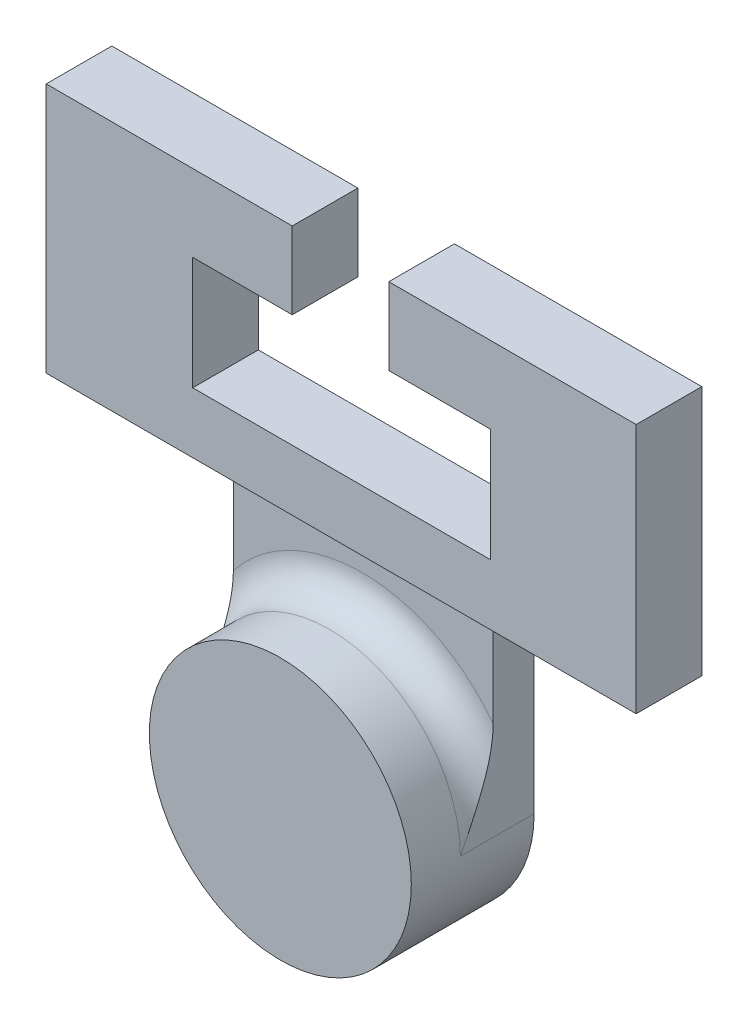
ISO-10303-21;
HEADER;
FILE_DESCRIPTION(('STEP AP214'),'2;1');
FILE_NAME('part.step','',(''),(''),'','','');
FILE_SCHEMA(('AUTOMOTIVE_DESIGN { 1 0 10303 214 1 1 1 1 }'));
ENDSEC;
DATA;
#1=APPLICATION_CONTEXT('core data for automotive mechanical design processes');
#2=APPLICATION_PROTOCOL_DEFINITION('international standard','automotive_design',2000,#1);
#3=PRODUCT_CONTEXT('',#1,'mechanical');
#4=PRODUCT('Part','Part','',(#3));
#5=PRODUCT_RELATED_PRODUCT_CATEGORY('part','',(#4));
#6=PRODUCT_DEFINITION_FORMATION('','',#4);
#7=PRODUCT_DEFINITION_CONTEXT('part definition',#1,'design');
#8=PRODUCT_DEFINITION('design','',#6,#7);
#9=PRODUCT_DEFINITION_SHAPE('','',#8);
#10=(LENGTH_UNIT() NAMED_UNIT(*) SI_UNIT(.MILLI.,.METRE.));
#11=(NAMED_UNIT(*) PLANE_ANGLE_UNIT() SI_UNIT($,.RADIAN.));
#12=(NAMED_UNIT(*) SI_UNIT($,.STERADIAN.) SOLID_ANGLE_UNIT());
#13=UNCERTAINTY_MEASURE_WITH_UNIT(LENGTH_MEASURE(1.E-05),#10,'distance_accuracy_value','');
#14=(GEOMETRIC_REPRESENTATION_CONTEXT(3) GLOBAL_UNCERTAINTY_ASSIGNED_CONTEXT((#13)) GLOBAL_UNIT_ASSIGNED_CONTEXT((#10,
#11,#12)) REPRESENTATION_CONTEXT('',''));
#15=CARTESIAN_POINT('',(0.,0.,0.));
#16=DIRECTION('',(0.,0.,1.));
#17=DIRECTION('',(1.,0.,0.));
#18=AXIS2_PLACEMENT_3D('',#15,#16,#17);
#19=CARTESIAN_POINT('',(0.,0.,-9.525));
#20=DIRECTION('',(0.,0.,1.));
#21=DIRECTION('',(1.,0.,0.));
#22=AXIS2_PLACEMENT_3D('',#19,#20,#21);
#23=CYLINDRICAL_SURFACE('',#22,10.16);
#24=DIRECTION('',(0.,0.,-1.));
#25=VECTOR('',#24,1.);
#26=CARTESIAN_POINT('',(10.16,0.,-6.35));
#27=LINE('',#26,#25);
#28=CARTESIAN_POINT('',(10.16,0.,-3.81));
#29=VERTEX_POINT('',#28);
#30=CARTESIAN_POINT('',(10.16,0.,-9.525));
#31=VERTEX_POINT('',#30);
#32=EDGE_CURVE('E75',#29,#31,#27,.T.);
#33=ORIENTED_EDGE('',*,*,#32,.F.);
#34=CARTESIAN_POINT('',(0.,0.,-3.81));
#35=DIRECTION('',(0.,0.,1.));
#36=DIRECTION('',(1.,0.,0.));
#37=AXIS2_PLACEMENT_3D('',#34,#35,#36);
#38=CIRCLE('',#37,10.16);
#39=CARTESIAN_POINT('',(-9.99152441464391,1.84256339689434,-3.81));
#40=VERTEX_POINT('',#39);
#41=EDGE_CURVE('E402',#29,#40,#38,.T.);
#42=ORIENTED_EDGE('',*,*,#41,.T.);
#43=DIRECTION('',(0.,0.,1.));
#44=VECTOR('',#43,1.);
#45=CARTESIAN_POINT('',(-9.99152441464391,1.84256339689434,-9.525));
#46=LINE('',#45,#44);
#47=CARTESIAN_POINT('',(-9.99152441464391,1.84256339689432,-9.525));
#48=VERTEX_POINT('',#47);
#49=EDGE_CURVE('E78',#48,#40,#46,.T.);
#50=ORIENTED_EDGE('',*,*,#49,.F.);
#51=CARTESIAN_POINT('',(0.,0.,-9.525));
#52=DIRECTION('',(0.,0.,1.));
#53=DIRECTION('',(1.,0.,0.));
#54=AXIS2_PLACEMENT_3D('',#51,#52,#53);
#55=CIRCLE('',#54,10.16);
#56=EDGE_CURVE('E292',#48,#31,#55,.T.);
#57=ORIENTED_EDGE('',*,*,#56,.T.);
#58=EDGE_LOOP('',(#33,#42,#50,#57));
#59=FACE_BOUND('',#58,.T.);
#60=CARTESIAN_POINT('',(0.,0.,0.));
#61=DIRECTION('',(0.,0.,1.));
#62=DIRECTION('',(1.,0.,0.));
#63=AXIS2_PLACEMENT_3D('',#60,#61,#62);
#64=CIRCLE('',#63,10.16);
#65=CARTESIAN_POINT('',(10.16,0.,0.));
#66=VERTEX_POINT('',#65);
#67=EDGE_CURVE('E288',#66,#66,#64,.T.);
#68=ORIENTED_EDGE('',*,*,#67,.F.);
#69=EDGE_LOOP('',(#68));
#70=FACE_BOUND('',#69,.T.);
#71=ADVANCED_FACE('F49',(#59,#70),#23,.T.);
#72=CARTESIAN_POINT('',(0.,0.,-9.525));
#73=DIRECTION('',(0.,0.,1.));
#74=DIRECTION('',(1.,0.,0.));
#75=AXIS2_PLACEMENT_3D('',#72,#73,#74);
#76=PLANE('',#75);
#77=ORIENTED_EDGE('',*,*,#56,.F.);
#78=DIRECTION('',(0.,1.,0.));
#79=VECTOR('',#78,1.);
#80=CARTESIAN_POINT('',(-9.99152441464391,0.,-9.525));
#81=LINE('',#80,#79);
#82=CARTESIAN_POINT('',(-9.99152441464391,15.7544963007669,-9.525));
#83=VERTEX_POINT('',#82);
#84=EDGE_CURVE('E274',#48,#83,#81,.T.);
#85=ORIENTED_EDGE('',*,*,#84,.T.);
#86=DIRECTION('',(-1.,0.,0.));
#87=VECTOR('',#86,1.);
#88=CARTESIAN_POINT('',(-9.99152441464391,15.7544963007669,-9.525));
#89=LINE('',#88,#87);
#90=CARTESIAN_POINT('',(-22.5940298544979,15.7544963007669,-9.525));
#91=VERTEX_POINT('',#90);
#92=EDGE_CURVE('E326',#83,#91,#89,.T.);
#93=ORIENTED_EDGE('',*,*,#92,.T.);
#94=DIRECTION('',(0.,-1.,0.));
#95=VECTOR('',#94,1.);
#96=CARTESIAN_POINT('',(-22.5940298544979,20.4534963007669,-9.525));
#97=LINE('',#96,#95);
#98=CARTESIAN_POINT('',(-22.5940298544979,35.1854963007669,-9.525));
#99=VERTEX_POINT('',#98);
#100=EDGE_CURVE('E186',#99,#91,#97,.T.);
#101=ORIENTED_EDGE('',*,*,#100,.F.);
#102=DIRECTION('',(-1.,0.,0.));
#103=VECTOR('',#102,1.);
#104=CARTESIAN_POINT('',(-22.5940298544979,35.1854963007669,-9.525));
#105=LINE('',#104,#103);
#106=CARTESIAN_POINT('',(-3.51021879319782,35.1854963007669,-9.525));
#107=VERTEX_POINT('',#106);
#108=EDGE_CURVE('E205',#107,#99,#105,.T.);
#109=ORIENTED_EDGE('',*,*,#108,.F.);
#110=DIRECTION('',(0.,-1.,0.));
#111=VECTOR('',#110,1.);
#112=CARTESIAN_POINT('',(-3.51021879319782,35.1854963007669,-9.525));
#113=LINE('',#112,#111);
#114=CARTESIAN_POINT('',(-3.51021879319782,29.2164963007669,-9.525));
#115=VERTEX_POINT('',#114);
#116=EDGE_CURVE('E214',#107,#115,#113,.T.);
#117=ORIENTED_EDGE('',*,*,#116,.T.);
#118=DIRECTION('',(-1.,0.,0.));
#119=VECTOR('',#118,1.);
#120=CARTESIAN_POINT('',(-22.5940298544979,29.2164963007669,-9.525));
#121=LINE('',#120,#119);
#122=CARTESIAN_POINT('',(-11.2292856636925,29.2164963007669,-9.525));
#123=VERTEX_POINT('',#122);
#124=EDGE_CURVE('E204',#115,#123,#121,.T.);
#125=ORIENTED_EDGE('',*,*,#124,.T.);
#126=DIRECTION('',(0.,-1.,0.));
#127=VECTOR('',#126,1.);
#128=CARTESIAN_POINT('',(-11.2292856636925,29.2164963007669,-9.525));
#129=LINE('',#128,#127);
#130=CARTESIAN_POINT('',(-11.2292856636925,20.4534963007669,-9.525));
#131=VERTEX_POINT('',#130);
#132=EDGE_CURVE('E360',#123,#131,#129,.T.);
#133=ORIENTED_EDGE('',*,*,#132,.T.);
#134=DIRECTION('',(-1.,0.,0.));
#135=VECTOR('',#134,1.);
#136=CARTESIAN_POINT('',(23.1661170587528,20.4534963007669,-9.525));
#137=LINE('',#136,#135);
#138=CARTESIAN_POINT('',(11.8519896998851,20.4534963007669,-9.525));
#139=VERTEX_POINT('',#138);
#140=EDGE_CURVE('E315',#139,#131,#137,.T.);
#141=ORIENTED_EDGE('',*,*,#140,.F.);
#142=DIRECTION('',(0.,-1.,0.));
#143=VECTOR('',#142,1.);
#144=CARTESIAN_POINT('',(11.8519896998851,29.2164963007669,-9.525));
#145=LINE('',#144,#143);
#146=CARTESIAN_POINT('',(11.8519896998851,29.2164963007669,-9.525));
#147=VERTEX_POINT('',#146);
#148=EDGE_CURVE('E230',#147,#139,#145,.T.);
#149=ORIENTED_EDGE('',*,*,#148,.F.);
#150=DIRECTION('',(-1.,0.,0.));
#151=VECTOR('',#150,1.);
#152=CARTESIAN_POINT('',(23.1661170587528,29.2164963007669,-9.525));
#153=LINE('',#152,#151);
#154=CARTESIAN_POINT('',(3.98107233357738,29.2164963007669,-9.525));
#155=VERTEX_POINT('',#154);
#156=EDGE_CURVE('E218',#147,#155,#153,.T.);
#157=ORIENTED_EDGE('',*,*,#156,.T.);
#158=DIRECTION('',(0.,-1.,0.));
#159=VECTOR('',#158,1.);
#160=CARTESIAN_POINT('',(3.98107233357738,35.1854963007669,-9.525));
#161=LINE('',#160,#159);
#162=CARTESIAN_POINT('',(3.98107233357738,35.1854963007669,-9.525));
#163=VERTEX_POINT('',#162);
#164=EDGE_CURVE('E227',#163,#155,#161,.T.);
#165=ORIENTED_EDGE('',*,*,#164,.F.);
#166=DIRECTION('',(-1.,0.,0.));
#167=VECTOR('',#166,1.);
#168=CARTESIAN_POINT('',(23.1661170587528,35.1854963007669,-9.525));
#169=LINE('',#168,#167);
#170=CARTESIAN_POINT('',(23.1661170587528,35.1854963007669,-9.525));
#171=VERTEX_POINT('',#170);
#172=EDGE_CURVE('E371',#171,#163,#169,.T.);
#173=ORIENTED_EDGE('',*,*,#172,.F.);
#174=DIRECTION('',(0.,-1.,0.));
#175=VECTOR('',#174,1.);
#176=CARTESIAN_POINT('',(23.1661170587528,20.4534963007669,-9.525));
#177=LINE('',#176,#175);
#178=CARTESIAN_POINT('',(23.1661170587528,15.7544963007669,-9.525));
#179=VERTEX_POINT('',#178);
#180=EDGE_CURVE('E311',#171,#179,#177,.T.);
#181=ORIENTED_EDGE('',*,*,#180,.T.);
#182=CARTESIAN_POINT('',(10.16,15.7544963007669,-9.525));
#183=VERTEX_POINT('',#182);
#184=EDGE_CURVE('E328',#179,#183,#89,.T.);
#185=ORIENTED_EDGE('',*,*,#184,.T.);
#186=DIRECTION('',(0.,-1.,0.));
#187=VECTOR('',#186,1.);
#188=CARTESIAN_POINT('',(10.16,0.,-9.525));
#189=LINE('',#188,#187);
#190=EDGE_CURVE('E271',#183,#31,#189,.T.);
#191=ORIENTED_EDGE('',*,*,#190,.T.);
#192=EDGE_LOOP('',(#77,#85,#93,#101,#109,#117,#125,#133,#141,#149,#157,#165,#173,#181,#185,#191));
#193=FACE_BOUND('',#192,.T.);
#194=ADVANCED_FACE('F418',(#193),#76,.F.);
#195=CARTESIAN_POINT('',(0.,0.,0.));
#196=DIRECTION('',(0.,0.,1.));
#197=DIRECTION('',(1.,0.,0.));
#198=AXIS2_PLACEMENT_3D('',#195,#196,#197);
#199=PLANE('',#198);
#200=ORIENTED_EDGE('',*,*,#67,.T.);
#201=EDGE_LOOP('',(#200));
#202=FACE_BOUND('',#201,.T.);
#203=ADVANCED_FACE('F415',(#202),#199,.T.);
#204=CARTESIAN_POINT('',(10.16,0.,-6.35));
#205=DIRECTION('',(1.,0.,0.));
#206=DIRECTION('',(0.,0.,-1.));
#207=AXIS2_PLACEMENT_3D('',#204,#205,#206);
#208=PLANE('',#207);
#209=ORIENTED_EDGE('',*,*,#190,.F.);
#210=DIRECTION('',(0.,0.,-1.));
#211=VECTOR('',#210,1.);
#212=CARTESIAN_POINT('',(10.16,15.7544963007669,-6.35));
#213=LINE('',#212,#211);
#214=CARTESIAN_POINT('',(10.16,15.7544963007669,-6.35));
#215=VERTEX_POINT('',#214);
#216=EDGE_CURVE('E279',#215,#183,#213,.T.);
#217=ORIENTED_EDGE('',*,*,#216,.F.);
#218=DIRECTION('',(0.,-1.,0.));
#219=VECTOR('',#218,1.);
#220=CARTESIAN_POINT('',(10.16,0.,-6.35));
#221=LINE('',#220,#219);
#222=CARTESIAN_POINT('',(10.16,7.62,-6.35));
#223=VERTEX_POINT('',#222);
#224=EDGE_CURVE('E262',#215,#223,#221,.T.);
#225=ORIENTED_EDGE('',*,*,#224,.T.);
#226=CARTESIAN_POINT('',(10.16,7.62,-6.35));
#227=CARTESIAN_POINT('',(10.16,7.48531515066392,-6.34998738549339));
#228=CARTESIAN_POINT('',(10.16,7.35067062177982,-6.34614433362632));
#229=CARTESIAN_POINT('',(10.16,7.08183206063732,-6.33149392471334));
#230=CARTESIAN_POINT('',(10.16,6.94763781547969,-6.3206905353365));
#231=CARTESIAN_POINT('',(10.16,6.68030920496207,-6.29285541165915));
#232=CARTESIAN_POINT('',(10.16,6.547172883357,-6.27584208485763));
#233=CARTESIAN_POINT('',(10.16,6.28173171403548,-6.2361830992997));
#234=CARTESIAN_POINT('',(10.16,6.14942699959302,-6.21353656022479));
#235=CARTESIAN_POINT('',(10.16,5.75744022457985,-6.13865075881821));
#236=CARTESIAN_POINT('',(10.16,5.49914595087492,-6.07906561940978));
#237=CARTESIAN_POINT('',(10.16,4.9866778493414,-5.94381397149523));
#238=CARTESIAN_POINT('',(10.16,4.73250776330905,-5.86813365195526));
#239=CARTESIAN_POINT('',(10.16,4.09447408165025,-5.66021776840484));
#240=CARTESIAN_POINT('',(10.16,3.71345575145994,-5.51929816365535));
#241=CARTESIAN_POINT('',(10.16,2.95998505951042,-5.21654930871913));
#242=CARTESIAN_POINT('',(10.16,2.58753385128791,-5.05471726192648));
#243=CARTESIAN_POINT('',(10.16,1.47645217652455,-4.54817844184918));
#244=CARTESIAN_POINT('',(10.16,0.747087599414854,-4.18354341672372));
#245=CARTESIAN_POINT('',(10.16,0.0120207088861088,-3.81601033970811));
#246=CARTESIAN_POINT('',(10.16,0.00601034734003663,-3.81300515875871));
#247=CARTESIAN_POINT('',(10.16,0.,-3.81));
#248=B_SPLINE_CURVE_WITH_KNOTS('',3,(#226,#227,#228,#229,#230,#231,#232,#233,#234,#235,#236,
#237,#238,#239,#240,#241,#242,#243,#244,#245,#246,#247),.UNSPECIFIED.,.F.,.F.,(4,2,2,2,2,2,2,2,
2,2,4),(0.,0.403941775402386,0.807653491422406,1.21017811631667,1.61276568446946,
2.40728510391765,3.20248905939678,4.42020965081925,5.63809325599656,8.08341455486778,
8.10357391993737),.UNSPECIFIED.);
#249=EDGE_CURVE('E64',#223,#29,#248,.T.);
#250=ORIENTED_EDGE('',*,*,#249,.T.);
#251=ORIENTED_EDGE('',*,*,#32,.T.);
#252=EDGE_LOOP('',(#209,#217,#225,#250,#251));
#253=FACE_BOUND('',#252,.T.);
#254=ADVANCED_FACE('F395',(#253),#208,.T.);
#255=CARTESIAN_POINT('',(-9.99152441464391,0.,-6.35));
#256=DIRECTION('',(-1.,0.,0.));
#257=DIRECTION('',(0.,0.,1.));
#258=AXIS2_PLACEMENT_3D('',#255,#256,#257);
#259=PLANE('',#258);
#260=ORIENTED_EDGE('',*,*,#84,.F.);
#261=ORIENTED_EDGE('',*,*,#49,.T.);
#262=CARTESIAN_POINT('',(-9.99152441464391,1.84256339689434,-3.81));
#263=CARTESIAN_POINT('',(-9.99152441464391,1.8424541535014,-3.84002277001059));
#264=CARTESIAN_POINT('',(-9.99152441464391,1.84549545338577,-3.86987717529825));
#265=CARTESIAN_POINT('',(-9.99152441464391,1.85678298219177,-3.92807109386576));
#266=CARTESIAN_POINT('',(-9.99152441464391,1.86493763302521,-3.9564279357417));
#267=CARTESIAN_POINT('',(-9.99152441464391,1.88941741091581,-4.02228915508515));
#268=CARTESIAN_POINT('',(-9.99152441464391,1.90768885654938,-4.05904688256618));
#269=CARTESIAN_POINT('',(-9.99152441464391,1.94960856494291,-4.12961102227543));
#270=CARTESIAN_POINT('',(-9.99152441464391,1.97330102864746,-4.1633898209084));
#271=CARTESIAN_POINT('',(-9.99152441464391,2.03397782414861,-4.24085622840689));
#272=CARTESIAN_POINT('',(-9.99152441464391,2.072545407596,-4.28328018597718));
#273=CARTESIAN_POINT('',(-9.99152441464391,2.1535040677536,-4.36436043720737));
#274=CARTESIAN_POINT('',(-9.99152441464391,2.19590385499025,-4.40300770974189));
#275=CARTESIAN_POINT('',(-9.99152441464391,2.28333861908611,-4.47766551515141));
#276=CARTESIAN_POINT('',(-9.99152441464391,2.32838659819299,-4.51366067061064));
#277=CARTESIAN_POINT('',(-9.99152441464391,2.42008569684124,-4.58341184269001));
#278=CARTESIAN_POINT('',(-9.99152441464391,2.46673498334053,-4.61717029793561));
#279=CARTESIAN_POINT('',(-9.99152441464391,2.61073375758317,-4.71745493090725));
#280=CARTESIAN_POINT('',(-9.99152441464391,2.70998320006213,-4.78124563746716));
#281=CARTESIAN_POINT('',(-9.99152441464391,2.91151882388832,-4.90387224561832));
#282=CARTESIAN_POINT('',(-9.99152441464391,3.01380685437798,-4.96270504290685));
#283=CARTESIAN_POINT('',(-9.99152441464391,3.22075938747354,-5.07651912125594));
#284=CARTESIAN_POINT('',(-9.99152441464391,3.32542813378245,-5.13149267117613));
#285=CARTESIAN_POINT('',(-9.99152441464391,3.53651012487133,-5.23799123015613));
#286=CARTESIAN_POINT('',(-9.99152441464391,3.6429235853784,-5.28951580869927));
#287=CARTESIAN_POINT('',(-9.99152441464391,3.96398864000632,-5.4391233857646));
#288=CARTESIAN_POINT('',(-9.99152441464391,4.18087108775008,-5.53245970336203));
#289=CARTESIAN_POINT('',(-9.99152441464391,4.61936847081786,-5.70652491553394));
#290=CARTESIAN_POINT('',(-9.99152441464391,4.84097841218383,-5.78726643134826));
#291=CARTESIAN_POINT('',(-9.99152441464391,5.28916109148242,-5.93526350728379));
#292=CARTESIAN_POINT('',(-9.99152441464391,5.515742455341,-6.00249316391068));
#293=CARTESIAN_POINT('',(-9.99152441464391,5.97294196221452,-6.121380694361));
#294=CARTESIAN_POINT('',(-9.99152441464391,6.20355933226168,-6.17304151610089));
#295=CARTESIAN_POINT('',(-9.99152441464391,6.66717054083647,-6.25810196390566));
#296=CARTESIAN_POINT('',(-9.99152441464391,6.90014895556861,-6.29158295762819));
#297=CARTESIAN_POINT('',(-9.99152441464391,7.25132609900462,-6.32604077615286));
#298=CARTESIAN_POINT('',(-9.99152441464391,7.36877217517777,-6.33490025720308));
#299=CARTESIAN_POINT('',(-9.99152441464391,7.60400221836609,-6.34687724537841));
#300=CARTESIAN_POINT('',(-9.99152441464391,7.72178630599323,-6.34999235334623));
#301=CARTESIAN_POINT('',(-9.99152441464391,7.83960712482295,-6.35));
#302=B_SPLINE_CURVE_WITH_KNOTS('',3,(#262,#263,#264,#265,#266,#267,#268,#269,#270,#271,#272,
#273,#274,#275,#276,#277,#278,#279,#280,#281,#282,#283,#284,#285,#286,#287,#288,#289,#290,#291,
#292,#293,#294,#295,#296,#297,#298,#299,#300,#301),.UNSPECIFIED.,.F.,.F.,(4,2,2,2,2,2,2,2,2,2,2,
2,2,2,2,2,2,2,2,4),(0.,0.0896456732726146,0.177729966668581,0.300174692897662,0.423655803804338,
0.595221837632734,0.767188146118511,0.940083752090281,1.11278764163755,1.46648065172118,
1.82039349967972,2.17499621509288,2.5296431114446,3.23755411350122,3.94475109705057,
4.65329117556496,5.36169700953223,6.06690552666625,6.42012003341047,6.77348202803256),.UNSPECIFIED.);
#303=CARTESIAN_POINT('',(-9.99152441464391,7.83960712482295,-6.35));
#304=VERTEX_POINT('',#303);
#305=EDGE_CURVE('E12',#40,#304,#302,.T.);
#306=ORIENTED_EDGE('',*,*,#305,.T.);
#307=DIRECTION('',(0.,1.,0.));
#308=VECTOR('',#307,1.);
#309=CARTESIAN_POINT('',(-9.99152441464391,0.,-6.35));
#310=LINE('',#309,#308);
#311=CARTESIAN_POINT('',(-9.99152441464391,15.7544963007669,-6.35));
#312=VERTEX_POINT('',#311);
#313=EDGE_CURVE('E256',#304,#312,#310,.T.);
#314=ORIENTED_EDGE('',*,*,#313,.T.);
#315=DIRECTION('',(0.,0.,-1.));
#316=VECTOR('',#315,1.);
#317=CARTESIAN_POINT('',(-9.99152441464391,15.7544963007669,-6.35));
#318=LINE('',#317,#316);
#319=EDGE_CURVE('E285',#312,#83,#318,.T.);
#320=ORIENTED_EDGE('',*,*,#319,.T.);
#321=EDGE_LOOP('',(#260,#261,#306,#314,#320));
#322=FACE_BOUND('',#321,.T.);
#323=ADVANCED_FACE('F414',(#322),#259,.T.);
#324=CARTESIAN_POINT('',(0.,0.,-6.35));
#325=DIRECTION('',(0.,0.,1.));
#326=DIRECTION('',(1.,0.,0.));
#327=AXIS2_PLACEMENT_3D('',#324,#325,#326);
#328=PLANE('',#327);
#329=ORIENTED_EDGE('',*,*,#313,.F.);
#330=CARTESIAN_POINT('',(0.,0.,-6.35));
#331=DIRECTION('',(0.,0.,1.));
#332=DIRECTION('',(1.,0.,0.));
#333=AXIS2_PLACEMENT_3D('',#330,#331,#332);
#334=CIRCLE('',#333,12.7);
#335=EDGE_CURVE('E294',#304,#223,#334,.F.);
#336=ORIENTED_EDGE('',*,*,#335,.T.);
#337=ORIENTED_EDGE('',*,*,#224,.F.);
#338=DIRECTION('',(1.,0.,0.));
#339=VECTOR('',#338,1.);
#340=CARTESIAN_POINT('',(10.16,15.7544963007669,-6.35));
#341=LINE('',#340,#339);
#342=EDGE_CURVE('E263',#312,#215,#341,.T.);
#343=ORIENTED_EDGE('',*,*,#342,.F.);
#344=EDGE_LOOP('',(#329,#336,#337,#343));
#345=FACE_BOUND('',#344,.T.);
#346=ADVANCED_FACE('F397',(#345),#328,.T.);
#347=CARTESIAN_POINT('',(-22.5940298544979,20.4534963007669,-9.525));
#348=DIRECTION('',(1.,0.,0.));
#349=DIRECTION('',(0.,0.,-1.));
#350=AXIS2_PLACEMENT_3D('',#347,#348,#349);
#351=PLANE('',#350);
#352=DIRECTION('',(0.,0.,1.));
#353=VECTOR('',#352,1.);
#354=CARTESIAN_POINT('',(-22.5940298544979,15.7544963007669,-9.525));
#355=LINE('',#354,#353);
#356=CARTESIAN_POINT('',(-22.5940298544979,15.7544963007669,-4.4350592362056));
#357=VERTEX_POINT('',#356);
#358=EDGE_CURVE('E185',#91,#357,#355,.T.);
#359=ORIENTED_EDGE('',*,*,#358,.T.);
#360=DIRECTION('',(0.,-1.,0.));
#361=VECTOR('',#360,1.);
#362=CARTESIAN_POINT('',(-22.5940298544979,20.4534963007669,-4.4350592362056));
#363=LINE('',#362,#361);
#364=CARTESIAN_POINT('',(-22.5940298544979,35.1854963007669,-4.4350592362056));
#365=VERTEX_POINT('',#364);
#366=EDGE_CURVE('E174',#365,#357,#363,.T.);
#367=ORIENTED_EDGE('',*,*,#366,.F.);
#368=DIRECTION('',(0.,0.,1.));
#369=VECTOR('',#368,1.);
#370=CARTESIAN_POINT('',(-22.5940298544979,35.1854963007669,-9.525));
#371=LINE('',#370,#369);
#372=EDGE_CURVE('E178',#99,#365,#371,.T.);
#373=ORIENTED_EDGE('',*,*,#372,.F.);
#374=ORIENTED_EDGE('',*,*,#100,.T.);
#375=EDGE_LOOP('',(#359,#367,#373,#374));
#376=FACE_BOUND('',#375,.T.);
#377=ADVANCED_FACE('F179',(#376),#351,.F.);
#378=CARTESIAN_POINT('',(-22.5940298544979,20.4534963007669,-4.4350592362056));
#379=DIRECTION('',(0.,0.,-1.));
#380=DIRECTION('',(-1.,0.,0.));
#381=AXIS2_PLACEMENT_3D('',#378,#379,#380);
#382=PLANE('',#381);
#383=DIRECTION('',(1.,0.,0.));
#384=VECTOR('',#383,1.);
#385=CARTESIAN_POINT('',(-22.5940298544979,15.7544963007669,-4.4350592362056));
#386=LINE('',#385,#384);
#387=CARTESIAN_POINT('',(23.1661170587528,15.7544963007669,-4.4350592362056));
#388=VERTEX_POINT('',#387);
#389=EDGE_CURVE('E304',#357,#388,#386,.T.);
#390=ORIENTED_EDGE('',*,*,#389,.T.);
#391=DIRECTION('',(0.,-1.,0.));
#392=VECTOR('',#391,1.);
#393=CARTESIAN_POINT('',(23.1661170587528,20.4534963007669,-4.4350592362056));
#394=LINE('',#393,#392);
#395=CARTESIAN_POINT('',(23.1661170587528,35.1854963007669,-4.4350592362056));
#396=VERTEX_POINT('',#395);
#397=EDGE_CURVE('E190',#396,#388,#394,.T.);
#398=ORIENTED_EDGE('',*,*,#397,.F.);
#399=DIRECTION('',(1.,0.,0.));
#400=VECTOR('',#399,1.);
#401=CARTESIAN_POINT('',(23.1661170587528,35.1854963007669,-4.4350592362056));
#402=LINE('',#401,#400);
#403=CARTESIAN_POINT('',(3.98107233357738,35.1854963007669,-4.4350592362056));
#404=VERTEX_POINT('',#403);
#405=EDGE_CURVE('E237',#404,#396,#402,.T.);
#406=ORIENTED_EDGE('',*,*,#405,.F.);
#407=DIRECTION('',(0.,-1.,0.));
#408=VECTOR('',#407,1.);
#409=CARTESIAN_POINT('',(3.98107233357738,35.1854963007669,-4.4350592362056));
#410=LINE('',#409,#408);
#411=CARTESIAN_POINT('',(3.98107233357738,29.2164963007669,-4.4350592362056));
#412=VERTEX_POINT('',#411);
#413=EDGE_CURVE('E234',#404,#412,#410,.T.);
#414=ORIENTED_EDGE('',*,*,#413,.T.);
#415=DIRECTION('',(1.,0.,0.));
#416=VECTOR('',#415,1.);
#417=CARTESIAN_POINT('',(23.1661170587528,29.2164963007669,-4.4350592362056));
#418=LINE('',#417,#416);
#419=CARTESIAN_POINT('',(11.8519896998851,29.2164963007669,-4.4350592362056));
#420=VERTEX_POINT('',#419);
#421=EDGE_CURVE('E240',#412,#420,#418,.T.);
#422=ORIENTED_EDGE('',*,*,#421,.T.);
#423=DIRECTION('',(0.,-1.,0.));
#424=VECTOR('',#423,1.);
#425=CARTESIAN_POINT('',(11.8519896998851,29.2164963007669,-4.4350592362056));
#426=LINE('',#425,#424);
#427=CARTESIAN_POINT('',(11.8519896998851,20.4534963007669,-4.4350592362056));
#428=VERTEX_POINT('',#427);
#429=EDGE_CURVE('E341',#420,#428,#426,.T.);
#430=ORIENTED_EDGE('',*,*,#429,.T.);
#431=DIRECTION('',(1.,0.,0.));
#432=VECTOR('',#431,1.);
#433=CARTESIAN_POINT('',(-22.5940298544979,20.4534963007669,-4.4350592362056));
#434=LINE('',#433,#432);
#435=CARTESIAN_POINT('',(-11.2292856636925,20.4534963007669,-4.4350592362056));
#436=VERTEX_POINT('',#435);
#437=EDGE_CURVE('E320',#436,#428,#434,.T.);
#438=ORIENTED_EDGE('',*,*,#437,.F.);
#439=DIRECTION('',(0.,-1.,0.));
#440=VECTOR('',#439,1.);
#441=CARTESIAN_POINT('',(-11.2292856636925,29.2164963007669,-4.4350592362056));
#442=LINE('',#441,#440);
#443=CARTESIAN_POINT('',(-11.2292856636925,29.2164963007669,-4.4350592362056));
#444=VERTEX_POINT('',#443);
#445=EDGE_CURVE('E334',#444,#436,#442,.T.);
#446=ORIENTED_EDGE('',*,*,#445,.F.);
#447=DIRECTION('',(1.,0.,0.));
#448=VECTOR('',#447,1.);
#449=CARTESIAN_POINT('',(-22.5940298544979,29.2164963007669,-4.4350592362056));
#450=LINE('',#449,#448);
#451=CARTESIAN_POINT('',(-3.51021879319782,29.2164963007669,-4.4350592362056));
#452=VERTEX_POINT('',#451);
#453=EDGE_CURVE('E216',#444,#452,#450,.T.);
#454=ORIENTED_EDGE('',*,*,#453,.T.);
#455=DIRECTION('',(0.,-1.,0.));
#456=VECTOR('',#455,1.);
#457=CARTESIAN_POINT('',(-3.51021879319782,35.1854963007669,-4.4350592362056));
#458=LINE('',#457,#456);
#459=CARTESIAN_POINT('',(-3.51021879319782,35.1854963007669,-4.4350592362056));
#460=VERTEX_POINT('',#459);
#461=EDGE_CURVE('E195',#460,#452,#458,.T.);
#462=ORIENTED_EDGE('',*,*,#461,.F.);
#463=DIRECTION('',(1.,0.,0.));
#464=VECTOR('',#463,1.);
#465=CARTESIAN_POINT('',(-22.5940298544979,35.1854963007669,-4.4350592362056));
#466=LINE('',#465,#464);
#467=EDGE_CURVE('E189',#365,#460,#466,.T.);
#468=ORIENTED_EDGE('',*,*,#467,.F.);
#469=ORIENTED_EDGE('',*,*,#366,.T.);
#470=EDGE_LOOP('',(#390,#398,#406,#414,#422,#430,#438,#446,#454,#462,#468,#469));
#471=FACE_BOUND('',#470,.T.);
#472=ADVANCED_FACE('F192',(#471),#382,.F.);
#473=CARTESIAN_POINT('',(23.1661170587528,20.4534963007669,-4.4350592362056));
#474=DIRECTION('',(-1.,0.,0.));
#475=DIRECTION('',(0.,0.,1.));
#476=AXIS2_PLACEMENT_3D('',#473,#474,#475);
#477=PLANE('',#476);
#478=DIRECTION('',(0.,0.,-1.));
#479=VECTOR('',#478,1.);
#480=CARTESIAN_POINT('',(23.1661170587528,15.7544963007669,-4.4350592362056));
#481=LINE('',#480,#479);
#482=EDGE_CURVE('E307',#388,#179,#481,.T.);
#483=ORIENTED_EDGE('',*,*,#482,.T.);
#484=ORIENTED_EDGE('',*,*,#180,.F.);
#485=DIRECTION('',(0.,0.,-1.));
#486=VECTOR('',#485,1.);
#487=CARTESIAN_POINT('',(23.1661170587528,35.1854963007669,-9.525));
#488=LINE('',#487,#486);
#489=EDGE_CURVE('E245',#396,#171,#488,.T.);
#490=ORIENTED_EDGE('',*,*,#489,.F.);
#491=ORIENTED_EDGE('',*,*,#397,.T.);
#492=EDGE_LOOP('',(#483,#484,#490,#491));
#493=FACE_BOUND('',#492,.T.);
#494=ADVANCED_FACE('F390',(#493),#477,.F.);
#495=CARTESIAN_POINT('',(0.,20.4534963007669,0.));
#496=DIRECTION('',(0.,1.,0.));
#497=DIRECTION('',(0.,0.,1.));
#498=AXIS2_PLACEMENT_3D('',#495,#496,#497);
#499=PLANE('',#498);
#500=DIRECTION('',(0.,0.,-1.));
#501=VECTOR('',#500,1.);
#502=CARTESIAN_POINT('',(-11.2292856636925,20.4534963007669,-9.525));
#503=LINE('',#502,#501);
#504=EDGE_CURVE('E346',#436,#131,#503,.T.);
#505=ORIENTED_EDGE('',*,*,#504,.F.);
#506=ORIENTED_EDGE('',*,*,#437,.T.);
#507=DIRECTION('',(0.,0.,1.));
#508=VECTOR('',#507,1.);
#509=CARTESIAN_POINT('',(11.8519896998851,20.4534963007669,-9.525));
#510=LINE('',#509,#508);
#511=EDGE_CURVE('E345',#139,#428,#510,.T.);
#512=ORIENTED_EDGE('',*,*,#511,.F.);
#513=ORIENTED_EDGE('',*,*,#140,.T.);
#514=EDGE_LOOP('',(#505,#506,#512,#513));
#515=FACE_BOUND('',#514,.T.);
#516=ADVANCED_FACE('F519',(#515),#499,.T.);
#517=CARTESIAN_POINT('',(0.,15.7544963007669,0.));
#518=DIRECTION('',(0.,1.,0.));
#519=DIRECTION('',(0.,0.,1.));
#520=AXIS2_PLACEMENT_3D('',#517,#518,#519);
#521=PLANE('',#520);
#522=ORIENTED_EDGE('',*,*,#319,.F.);
#523=ORIENTED_EDGE('',*,*,#342,.T.);
#524=ORIENTED_EDGE('',*,*,#216,.T.);
#525=ORIENTED_EDGE('',*,*,#184,.F.);
#526=ORIENTED_EDGE('',*,*,#482,.F.);
#527=ORIENTED_EDGE('',*,*,#389,.F.);
#528=ORIENTED_EDGE('',*,*,#358,.F.);
#529=ORIENTED_EDGE('',*,*,#92,.F.);
#530=EDGE_LOOP('',(#522,#523,#524,#525,#526,#527,#528,#529));
#531=FACE_BOUND('',#530,.T.);
#532=ADVANCED_FACE('F324',(#531),#521,.F.);
#533=CARTESIAN_POINT('',(11.8519896998851,29.2164963007669,-9.525));
#534=DIRECTION('',(1.,0.,0.));
#535=DIRECTION('',(0.,0.,-1.));
#536=AXIS2_PLACEMENT_3D('',#533,#534,#535);
#537=PLANE('',#536);
#538=ORIENTED_EDGE('',*,*,#511,.T.);
#539=ORIENTED_EDGE('',*,*,#429,.F.);
#540=DIRECTION('',(0.,0.,1.));
#541=VECTOR('',#540,1.);
#542=CARTESIAN_POINT('',(11.8519896998851,29.2164963007669,-9.525));
#543=LINE('',#542,#541);
#544=EDGE_CURVE('E338',#147,#420,#543,.T.);
#545=ORIENTED_EDGE('',*,*,#544,.F.);
#546=ORIENTED_EDGE('',*,*,#148,.T.);
#547=EDGE_LOOP('',(#538,#539,#545,#546));
#548=FACE_BOUND('',#547,.T.);
#549=ADVANCED_FACE('F559',(#548),#537,.F.);
#550=CARTESIAN_POINT('',(-11.2292856636925,29.2164963007669,-9.525));
#551=DIRECTION('',(-1.,0.,0.));
#552=DIRECTION('',(0.,0.,1.));
#553=AXIS2_PLACEMENT_3D('',#550,#551,#552);
#554=PLANE('',#553);
#555=ORIENTED_EDGE('',*,*,#504,.T.);
#556=ORIENTED_EDGE('',*,*,#132,.F.);
#557=DIRECTION('',(0.,0.,-1.));
#558=VECTOR('',#557,1.);
#559=CARTESIAN_POINT('',(-11.2292856636925,29.2164963007669,-9.525));
#560=LINE('',#559,#558);
#561=EDGE_CURVE('E362',#444,#123,#560,.T.);
#562=ORIENTED_EDGE('',*,*,#561,.F.);
#563=ORIENTED_EDGE('',*,*,#445,.T.);
#564=EDGE_LOOP('',(#555,#556,#562,#563));
#565=FACE_BOUND('',#564,.T.);
#566=ADVANCED_FACE('F510',(#565),#554,.F.);
#567=CARTESIAN_POINT('',(0.,29.2164963007669,0.));
#568=DIRECTION('',(0.,1.,0.));
#569=DIRECTION('',(0.,0.,1.));
#570=AXIS2_PLACEMENT_3D('',#567,#568,#569);
#571=PLANE('',#570);
#572=ORIENTED_EDGE('',*,*,#453,.F.);
#573=ORIENTED_EDGE('',*,*,#561,.T.);
#574=ORIENTED_EDGE('',*,*,#124,.F.);
#575=DIRECTION('',(0.,0.,-1.));
#576=VECTOR('',#575,1.);
#577=CARTESIAN_POINT('',(-3.51021879319782,29.2164963007669,-9.525));
#578=LINE('',#577,#576);
#579=EDGE_CURVE('E208',#452,#115,#578,.T.);
#580=ORIENTED_EDGE('',*,*,#579,.F.);
#581=EDGE_LOOP('',(#572,#573,#574,#580));
#582=FACE_BOUND('',#581,.T.);
#583=ADVANCED_FACE('F499',(#582),#571,.F.);
#584=CARTESIAN_POINT('',(-3.51021879319782,35.1854963007669,-9.525));
#585=DIRECTION('',(-1.,0.,0.));
#586=DIRECTION('',(0.,0.,1.));
#587=AXIS2_PLACEMENT_3D('',#584,#585,#586);
#588=PLANE('',#587);
#589=ORIENTED_EDGE('',*,*,#579,.T.);
#590=ORIENTED_EDGE('',*,*,#116,.F.);
#591=DIRECTION('',(0.,0.,-1.));
#592=VECTOR('',#591,1.);
#593=CARTESIAN_POINT('',(-3.51021879319782,35.1854963007669,-9.525));
#594=LINE('',#593,#592);
#595=EDGE_CURVE('E197',#460,#107,#594,.T.);
#596=ORIENTED_EDGE('',*,*,#595,.F.);
#597=ORIENTED_EDGE('',*,*,#461,.T.);
#598=EDGE_LOOP('',(#589,#590,#596,#597));
#599=FACE_BOUND('',#598,.T.);
#600=ADVANCED_FACE('F487',(#599),#588,.F.);
#601=CARTESIAN_POINT('',(0.,35.1854963007669,0.));
#602=DIRECTION('',(0.,1.,0.));
#603=DIRECTION('',(0.,0.,1.));
#604=AXIS2_PLACEMENT_3D('',#601,#602,#603);
#605=PLANE('',#604);
#606=ORIENTED_EDGE('',*,*,#372,.T.);
#607=ORIENTED_EDGE('',*,*,#467,.T.);
#608=ORIENTED_EDGE('',*,*,#595,.T.);
#609=ORIENTED_EDGE('',*,*,#108,.T.);
#610=EDGE_LOOP('',(#606,#607,#608,#609));
#611=FACE_BOUND('',#610,.T.);
#612=ADVANCED_FACE('F199',(#611),#605,.T.);
#613=CARTESIAN_POINT('',(3.98107233357738,35.1854963007669,-9.525));
#614=DIRECTION('',(1.,0.,0.));
#615=DIRECTION('',(0.,0.,-1.));
#616=AXIS2_PLACEMENT_3D('',#613,#614,#615);
#617=PLANE('',#616);
#618=DIRECTION('',(0.,0.,1.));
#619=VECTOR('',#618,1.);
#620=CARTESIAN_POINT('',(3.98107233357738,29.2164963007669,-9.525));
#621=LINE('',#620,#619);
#622=EDGE_CURVE('E241',#155,#412,#621,.T.);
#623=ORIENTED_EDGE('',*,*,#622,.T.);
#624=ORIENTED_EDGE('',*,*,#413,.F.);
#625=DIRECTION('',(0.,0.,1.));
#626=VECTOR('',#625,1.);
#627=CARTESIAN_POINT('',(3.98107233357738,35.1854963007669,-9.525));
#628=LINE('',#627,#626);
#629=EDGE_CURVE('E253',#163,#404,#628,.T.);
#630=ORIENTED_EDGE('',*,*,#629,.F.);
#631=ORIENTED_EDGE('',*,*,#164,.T.);
#632=EDGE_LOOP('',(#623,#624,#630,#631));
#633=FACE_BOUND('',#632,.T.);
#634=ADVANCED_FACE('F382',(#633),#617,.F.);
#635=CARTESIAN_POINT('',(0.,35.1854963007669,0.));
#636=DIRECTION('',(0.,-1.,0.));
#637=DIRECTION('',(0.,0.,-1.));
#638=AXIS2_PLACEMENT_3D('',#635,#636,#637);
#639=PLANE('',#638);
#640=ORIENTED_EDGE('',*,*,#489,.T.);
#641=ORIENTED_EDGE('',*,*,#172,.T.);
#642=ORIENTED_EDGE('',*,*,#629,.T.);
#643=ORIENTED_EDGE('',*,*,#405,.T.);
#644=EDGE_LOOP('',(#640,#641,#642,#643));
#645=FACE_BOUND('',#644,.T.);
#646=ADVANCED_FACE('F377',(#645),#639,.F.);
#647=CARTESIAN_POINT('',(0.,29.2164963007669,0.));
#648=DIRECTION('',(0.,-1.,0.));
#649=DIRECTION('',(0.,0.,-1.));
#650=AXIS2_PLACEMENT_3D('',#647,#648,#649);
#651=PLANE('',#650);
#652=ORIENTED_EDGE('',*,*,#156,.F.);
#653=ORIENTED_EDGE('',*,*,#544,.T.);
#654=ORIENTED_EDGE('',*,*,#421,.F.);
#655=ORIENTED_EDGE('',*,*,#622,.F.);
#656=EDGE_LOOP('',(#652,#653,#654,#655));
#657=FACE_BOUND('',#656,.T.);
#658=ADVANCED_FACE('F431',(#657),#651,.T.);
#659=CARTESIAN_POINT('',(0.,0.,-3.81));
#660=DIRECTION('',(0.,0.,1.));
#661=DIRECTION('',(1.,0.,0.));
#662=AXIS2_PLACEMENT_3D('',#659,#660,#661);
#663=TOROIDAL_SURFACE('',#662,12.7,2.54);
#664=ORIENTED_EDGE('',*,*,#305,.F.);
#665=ORIENTED_EDGE('',*,*,#41,.F.);
#666=ORIENTED_EDGE('',*,*,#249,.F.);
#667=ORIENTED_EDGE('',*,*,#335,.F.);
#668=EDGE_LOOP('',(#664,#665,#666,#667));
#669=FACE_BOUND('',#668,.T.);
#670=ADVANCED_FACE('F55',(#669),#663,.F.);
#671=CLOSED_SHELL('',(#71,#194,#203,#254,#323,#346,#377,#472,#494,#516,#532,#549,#566,#583,#600,
#612,#634,#646,#658,#670));
#672=MANIFOLD_SOLID_BREP('B2',#671);
#673=ADVANCED_BREP_SHAPE_REPRESENTATION('',(#18,#672),#14);
#674=SHAPE_DEFINITION_REPRESENTATION(#9,#673);
ENDSEC;
END-ISO-10303-21;
